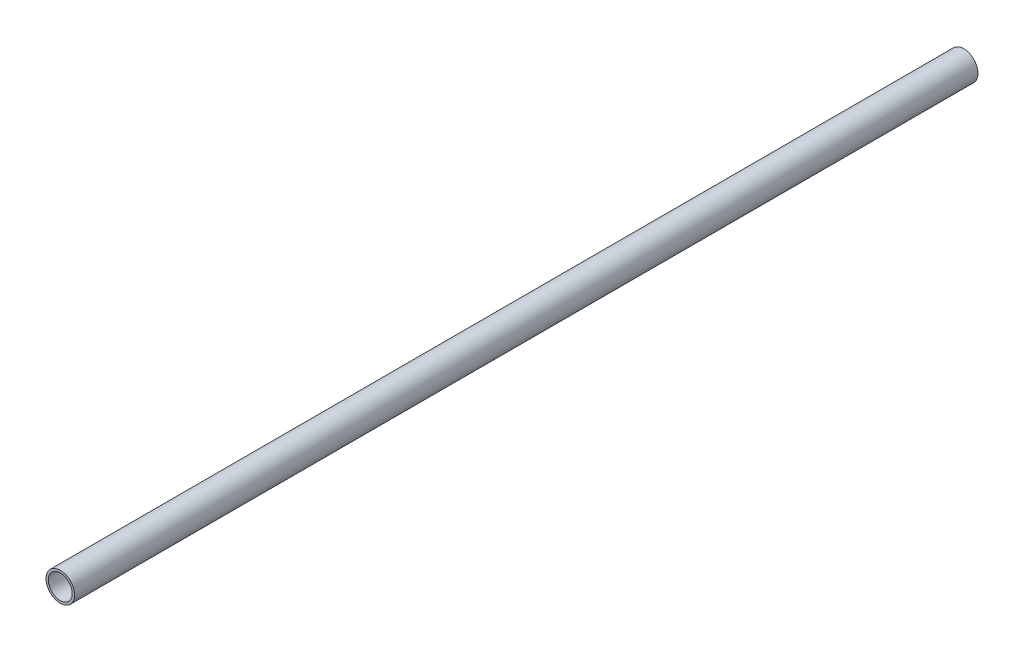
ISO-10303-21;
HEADER;
FILE_DESCRIPTION(('STEP AP214'),'2;1');
FILE_NAME('part.step','',(''),(''),'','','');
FILE_SCHEMA(('AUTOMOTIVE_DESIGN { 1 0 10303 214 1 1 1 1 }'));
ENDSEC;
DATA;
#1=APPLICATION_CONTEXT('core data for automotive mechanical design processes');
#2=APPLICATION_PROTOCOL_DEFINITION('international standard','automotive_design',2000,#1);
#3=PRODUCT_CONTEXT('',#1,'mechanical');
#4=PRODUCT('Part','Part','',(#3));
#5=PRODUCT_RELATED_PRODUCT_CATEGORY('part','',(#4));
#6=PRODUCT_DEFINITION_FORMATION('','',#4);
#7=PRODUCT_DEFINITION_CONTEXT('part definition',#1,'design');
#8=PRODUCT_DEFINITION('design','',#6,#7);
#9=PRODUCT_DEFINITION_SHAPE('','',#8);
#10=(LENGTH_UNIT() NAMED_UNIT(*) SI_UNIT(.MILLI.,.METRE.));
#11=(NAMED_UNIT(*) PLANE_ANGLE_UNIT() SI_UNIT($,.RADIAN.));
#12=(NAMED_UNIT(*) SI_UNIT($,.STERADIAN.) SOLID_ANGLE_UNIT());
#13=UNCERTAINTY_MEASURE_WITH_UNIT(LENGTH_MEASURE(1.E-05),#10,'distance_accuracy_value','');
#14=(GEOMETRIC_REPRESENTATION_CONTEXT(3) GLOBAL_UNCERTAINTY_ASSIGNED_CONTEXT((#13)) GLOBAL_UNIT_ASSIGNED_CONTEXT((#10,
#11,#12)) REPRESENTATION_CONTEXT('',''));
#15=CARTESIAN_POINT('',(0.,0.,0.));
#16=DIRECTION('',(0.,0.,1.));
#17=DIRECTION('',(1.,0.,0.));
#18=AXIS2_PLACEMENT_3D('',#15,#16,#17);
#19=CARTESIAN_POINT('',(0.,0.,1524.));
#20=DIRECTION('',(0.,0.,1.));
#21=DIRECTION('',(1.,0.,0.));
#22=AXIS2_PLACEMENT_3D('',#19,#20,#21);
#23=PLANE('',#22);
#24=CARTESIAN_POINT('',(0.,0.,1524.));
#25=DIRECTION('',(0.,0.,1.));
#26=DIRECTION('',(1.,0.,0.));
#27=AXIS2_PLACEMENT_3D('',#24,#25,#26);
#28=CIRCLE('',#27,24.13);
#29=CARTESIAN_POINT('',(24.13,0.,1524.));
#30=VERTEX_POINT('',#29);
#31=EDGE_CURVE('E10',#30,#30,#28,.T.);
#32=ORIENTED_EDGE('',*,*,#31,.T.);
#33=EDGE_LOOP('',(#32));
#34=FACE_BOUND('',#33,.T.);
#35=CARTESIAN_POINT('',(0.,0.,1524.));
#36=DIRECTION('',(0.,0.,1.));
#37=DIRECTION('',(1.,0.,0.));
#38=AXIS2_PLACEMENT_3D('',#35,#36,#37);
#39=CIRCLE('',#38,20.193);
#40=CARTESIAN_POINT('',(20.193,0.,1524.));
#41=VERTEX_POINT('',#40);
#42=EDGE_CURVE('E42',#41,#41,#39,.T.);
#43=ORIENTED_EDGE('',*,*,#42,.F.);
#44=EDGE_LOOP('',(#43));
#45=FACE_BOUND('',#44,.T.);
#46=ADVANCED_FACE('F31',(#34,#45),#23,.T.);
#47=CARTESIAN_POINT('',(0.,0.,0.));
#48=DIRECTION('',(0.,0.,1.));
#49=DIRECTION('',(1.,0.,0.));
#50=AXIS2_PLACEMENT_3D('',#47,#48,#49);
#51=PLANE('',#50);
#52=CARTESIAN_POINT('',(0.,0.,0.));
#53=DIRECTION('',(0.,0.,1.));
#54=DIRECTION('',(1.,0.,0.));
#55=AXIS2_PLACEMENT_3D('',#52,#53,#54);
#56=CIRCLE('',#55,24.13);
#57=CARTESIAN_POINT('',(24.13,0.,0.));
#58=VERTEX_POINT('',#57);
#59=EDGE_CURVE('E35',#58,#58,#56,.T.);
#60=ORIENTED_EDGE('',*,*,#59,.F.);
#61=EDGE_LOOP('',(#60));
#62=FACE_BOUND('',#61,.T.);
#63=CARTESIAN_POINT('',(0.,0.,0.));
#64=DIRECTION('',(0.,0.,1.));
#65=DIRECTION('',(1.,0.,0.));
#66=AXIS2_PLACEMENT_3D('',#63,#64,#65);
#67=CIRCLE('',#66,20.193);
#68=CARTESIAN_POINT('',(20.193,0.,0.));
#69=VERTEX_POINT('',#68);
#70=EDGE_CURVE('E44',#69,#69,#67,.T.);
#71=ORIENTED_EDGE('',*,*,#70,.T.);
#72=EDGE_LOOP('',(#71));
#73=FACE_BOUND('',#72,.T.);
#74=ADVANCED_FACE('F54',(#62,#73),#51,.F.);
#75=CARTESIAN_POINT('',(0.,0.,1524.));
#76=DIRECTION('',(0.,0.,-1.));
#77=DIRECTION('',(-1.,0.,0.));
#78=AXIS2_PLACEMENT_3D('',#75,#76,#77);
#79=CYLINDRICAL_SURFACE('',#78,24.13);
#80=ORIENTED_EDGE('',*,*,#31,.F.);
#81=EDGE_LOOP('',(#80));
#82=FACE_BOUND('',#81,.T.);
#83=ORIENTED_EDGE('',*,*,#59,.T.);
#84=EDGE_LOOP('',(#83));
#85=FACE_BOUND('',#84,.T.);
#86=ADVANCED_FACE('F33',(#82,#85),#79,.T.);
#87=CARTESIAN_POINT('',(0.,0.,1524.));
#88=DIRECTION('',(0.,0.,-1.));
#89=DIRECTION('',(-1.,0.,0.));
#90=AXIS2_PLACEMENT_3D('',#87,#88,#89);
#91=CYLINDRICAL_SURFACE('',#90,20.193);
#92=ORIENTED_EDGE('',*,*,#42,.T.);
#93=EDGE_LOOP('',(#92));
#94=FACE_BOUND('',#93,.T.);
#95=ORIENTED_EDGE('',*,*,#70,.F.);
#96=EDGE_LOOP('',(#95));
#97=FACE_BOUND('',#96,.T.);
#98=ADVANCED_FACE('F50',(#94,#97),#91,.F.);
#99=CLOSED_SHELL('',(#46,#74,#86,#98));
#100=MANIFOLD_SOLID_BREP('B2',#99);
#101=ADVANCED_BREP_SHAPE_REPRESENTATION('',(#18,#100),#14);
#102=SHAPE_DEFINITION_REPRESENTATION(#9,#101);
ENDSEC;
END-ISO-10303-21;
